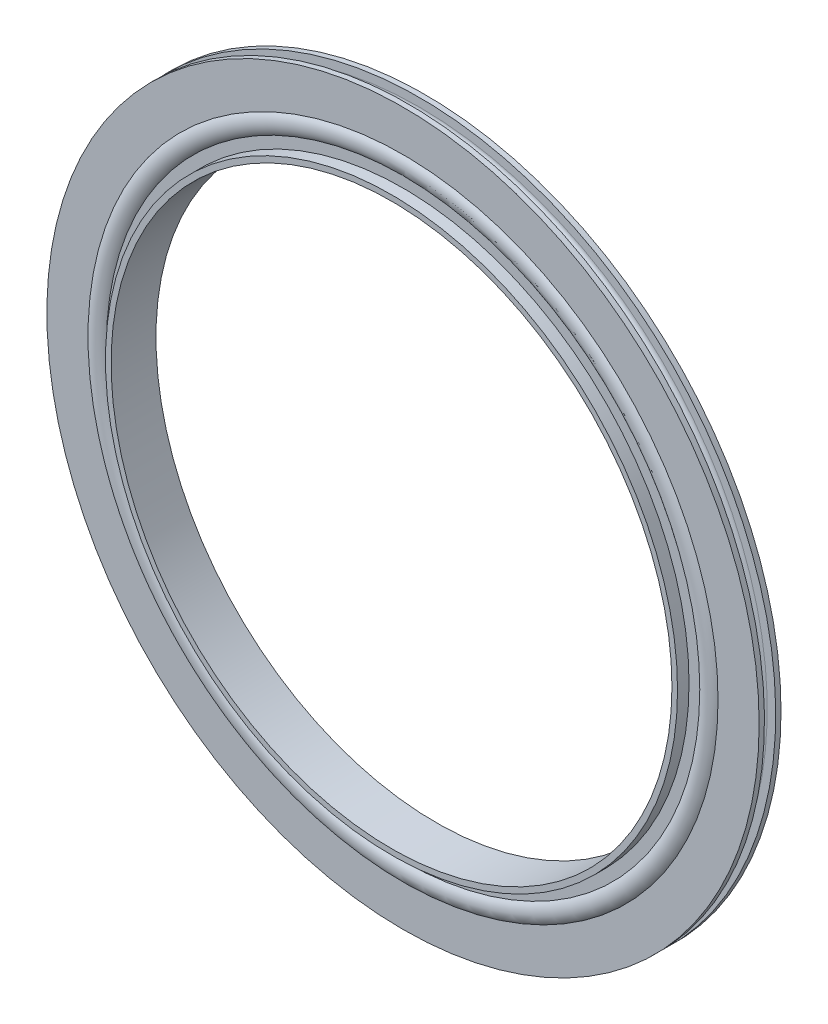
ISO-10303-21;
HEADER;
FILE_DESCRIPTION(('STEP AP214'),'2;1');
FILE_NAME('part.step','',(''),(''),'','','');
FILE_SCHEMA(('AUTOMOTIVE_DESIGN { 1 0 10303 214 1 1 1 1 }'));
ENDSEC;
DATA;
#1=APPLICATION_CONTEXT('core data for automotive mechanical design processes');
#2=APPLICATION_PROTOCOL_DEFINITION('international standard','automotive_design',2000,#1);
#3=PRODUCT_CONTEXT('',#1,'mechanical');
#4=PRODUCT('Part','Part','',(#3));
#5=PRODUCT_RELATED_PRODUCT_CATEGORY('part','',(#4));
#6=PRODUCT_DEFINITION_FORMATION('','',#4);
#7=PRODUCT_DEFINITION_CONTEXT('part definition',#1,'design');
#8=PRODUCT_DEFINITION('design','',#6,#7);
#9=PRODUCT_DEFINITION_SHAPE('','',#8);
#10=(LENGTH_UNIT() NAMED_UNIT(*) SI_UNIT(.MILLI.,.METRE.));
#11=(NAMED_UNIT(*) PLANE_ANGLE_UNIT() SI_UNIT($,.RADIAN.));
#12=(NAMED_UNIT(*) SI_UNIT($,.STERADIAN.) SOLID_ANGLE_UNIT());
#13=UNCERTAINTY_MEASURE_WITH_UNIT(LENGTH_MEASURE(1.E-05),#10,'distance_accuracy_value','');
#14=(GEOMETRIC_REPRESENTATION_CONTEXT(3) GLOBAL_UNCERTAINTY_ASSIGNED_CONTEXT((#13)) GLOBAL_UNIT_ASSIGNED_CONTEXT((#10,
#11,#12)) REPRESENTATION_CONTEXT('',''));
#15=CARTESIAN_POINT('',(0.,0.,0.));
#16=DIRECTION('',(0.,0.,1.));
#17=DIRECTION('',(1.,0.,0.));
#18=AXIS2_PLACEMENT_3D('',#15,#16,#17);
#19=CARTESIAN_POINT('',(0.,0.,1.95));
#20=DIRECTION('',(0.,0.,-1.));
#21=DIRECTION('',(-1.,0.,0.));
#22=AXIS2_PLACEMENT_3D('',#19,#20,#21);
#23=CYLINDRICAL_SURFACE('',#22,63.5);
#24=CARTESIAN_POINT('',(0.,0.,1.95));
#25=DIRECTION('',(0.,0.,1.));
#26=DIRECTION('',(1.,0.,0.));
#27=AXIS2_PLACEMENT_3D('',#24,#25,#26);
#28=CIRCLE('',#27,63.5);
#29=CARTESIAN_POINT('',(63.5,0.,1.95));
#30=VERTEX_POINT('',#29);
#31=EDGE_CURVE('E57',#30,#30,#28,.T.);
#32=ORIENTED_EDGE('',*,*,#31,.F.);
#33=EDGE_LOOP('',(#32));
#34=FACE_BOUND('',#33,.T.);
#35=CARTESIAN_POINT('',(0.,0.,1.));
#36=DIRECTION('',(0.,0.,1.));
#37=DIRECTION('',(0.,-1.,0.));
#38=AXIS2_PLACEMENT_3D('',#35,#36,#37);
#39=CIRCLE('',#38,63.5);
#40=CARTESIAN_POINT('',(0.,-63.5,0.999999999999992));
#41=VERTEX_POINT('',#40);
#42=EDGE_CURVE('E86',#41,#41,#39,.T.);
#43=ORIENTED_EDGE('',*,*,#42,.T.);
#44=EDGE_LOOP('',(#43));
#45=FACE_BOUND('',#44,.T.);
#46=ADVANCED_FACE('F43',(#34,#45),#23,.T.);
#47=CARTESIAN_POINT('',(0.,0.,-1.95));
#48=DIRECTION('',(0.,0.,1.));
#49=DIRECTION('',(1.,0.,0.));
#50=AXIS2_PLACEMENT_3D('',#47,#48,#49);
#51=CIRCLE('',#50,63.5);
#52=CARTESIAN_POINT('',(63.5,0.,-1.95));
#53=VERTEX_POINT('',#52);
#54=EDGE_CURVE('E60',#53,#53,#51,.T.);
#55=ORIENTED_EDGE('',*,*,#54,.T.);
#56=EDGE_LOOP('',(#55));
#57=FACE_BOUND('',#56,.T.);
#58=CARTESIAN_POINT('',(0.,0.,-1.));
#59=DIRECTION('',(0.,0.,1.));
#60=DIRECTION('',(0.,-1.,0.));
#61=AXIS2_PLACEMENT_3D('',#58,#59,#60);
#62=CIRCLE('',#61,63.5);
#63=CARTESIAN_POINT('',(0.,-63.5,-1.00000000000001));
#64=VERTEX_POINT('',#63);
#65=EDGE_CURVE('E95',#64,#64,#62,.T.);
#66=ORIENTED_EDGE('',*,*,#65,.F.);
#67=EDGE_LOOP('',(#66));
#68=FACE_BOUND('',#67,.T.);
#69=ADVANCED_FACE('F102',(#57,#68),#23,.T.);
#70=CARTESIAN_POINT('',(0.,0.,1.95));
#71=DIRECTION('',(0.,0.,1.));
#72=DIRECTION('',(1.,0.,0.));
#73=AXIS2_PLACEMENT_3D('',#70,#71,#72);
#74=PLANE('',#73);
#75=CARTESIAN_POINT('',(0.,0.,1.95));
#76=DIRECTION('',(0.,0.,1.));
#77=DIRECTION('',(1.,0.,0.));
#78=AXIS2_PLACEMENT_3D('',#75,#76,#77);
#79=CIRCLE('',#78,51.);
#80=CARTESIAN_POINT('',(51.,0.,1.95));
#81=VERTEX_POINT('',#80);
#82=EDGE_CURVE('E63',#81,#81,#79,.F.);
#83=ORIENTED_EDGE('',*,*,#82,.T.);
#84=EDGE_LOOP('',(#83));
#85=FACE_BOUND('',#84,.T.);
#86=CARTESIAN_POINT('',(0.,0.,1.95));
#87=DIRECTION('',(0.,0.,-1.));
#88=DIRECTION('',(-1.,0.,0.));
#89=AXIS2_PLACEMENT_3D('',#86,#87,#88);
#90=CIRCLE('',#89,52.9123943966673);
#91=CARTESIAN_POINT('',(-52.9123943966673,0.,1.95));
#92=VERTEX_POINT('',#91);
#93=EDGE_CURVE('E83',#92,#92,#90,.F.);
#94=ORIENTED_EDGE('',*,*,#93,.T.);
#95=EDGE_LOOP('',(#94));
#96=FACE_BOUND('',#95,.T.);
#97=ADVANCED_FACE('F104',(#85,#96),#74,.T.);
#98=CARTESIAN_POINT('',(0.,0.,-1.95));
#99=DIRECTION('',(0.,0.,1.));
#100=DIRECTION('',(1.,0.,0.));
#101=AXIS2_PLACEMENT_3D('',#98,#99,#100);
#102=PLANE('',#101);
#103=CARTESIAN_POINT('',(0.,0.,-1.95));
#104=DIRECTION('',(0.,0.,1.));
#105=DIRECTION('',(1.,0.,0.));
#106=AXIS2_PLACEMENT_3D('',#103,#104,#105);
#107=CIRCLE('',#106,51.);
#108=CARTESIAN_POINT('',(51.,0.,-1.95));
#109=VERTEX_POINT('',#108);
#110=EDGE_CURVE('E53',#109,#109,#107,.F.);
#111=ORIENTED_EDGE('',*,*,#110,.F.);
#112=EDGE_LOOP('',(#111));
#113=FACE_BOUND('',#112,.T.);
#114=CARTESIAN_POINT('',(0.,0.,-1.95));
#115=DIRECTION('',(0.,0.,-1.));
#116=DIRECTION('',(-1.,0.,0.));
#117=AXIS2_PLACEMENT_3D('',#114,#115,#116);
#118=CIRCLE('',#117,52.9123943966673);
#119=CARTESIAN_POINT('',(-52.9123943966673,0.,-1.95));
#120=VERTEX_POINT('',#119);
#121=EDGE_CURVE('E49',#120,#120,#118,.F.);
#122=ORIENTED_EDGE('',*,*,#121,.F.);
#123=EDGE_LOOP('',(#122));
#124=FACE_BOUND('',#123,.T.);
#125=ADVANCED_FACE('F111',(#113,#124),#102,.F.);
#126=CARTESIAN_POINT('',(0.,0.,-4.));
#127=DIRECTION('',(0.,0.,1.));
#128=DIRECTION('',(1.,0.,0.));
#129=AXIS2_PLACEMENT_3D('',#126,#127,#128);
#130=PLANE('',#129);
#131=CARTESIAN_POINT('',(0.,0.,-4.));
#132=DIRECTION('',(0.,0.,1.));
#133=DIRECTION('',(1.,0.,0.));
#134=AXIS2_PLACEMENT_3D('',#131,#132,#133);
#135=CIRCLE('',#134,50.);
#136=CARTESIAN_POINT('',(50.,0.,-4.));
#137=VERTEX_POINT('',#136);
#138=EDGE_CURVE('E72',#137,#137,#135,.T.);
#139=ORIENTED_EDGE('',*,*,#138,.T.);
#140=EDGE_LOOP('',(#139));
#141=FACE_BOUND('',#140,.T.);
#142=CARTESIAN_POINT('',(0.,0.,-4.));
#143=DIRECTION('',(0.,0.,1.));
#144=DIRECTION('',(1.,0.,0.));
#145=AXIS2_PLACEMENT_3D('',#142,#143,#144);
#146=CIRCLE('',#145,51.);
#147=CARTESIAN_POINT('',(51.,0.,-4.));
#148=VERTEX_POINT('',#147);
#149=EDGE_CURVE('E69',#148,#148,#146,.T.);
#150=ORIENTED_EDGE('',*,*,#149,.F.);
#151=EDGE_LOOP('',(#150));
#152=FACE_BOUND('',#151,.T.);
#153=ADVANCED_FACE('F133',(#141,#152),#130,.F.);
#154=CARTESIAN_POINT('',(0.,0.,4.));
#155=DIRECTION('',(0.,0.,-1.));
#156=DIRECTION('',(-1.,0.,0.));
#157=AXIS2_PLACEMENT_3D('',#154,#155,#156);
#158=CYLINDRICAL_SURFACE('',#157,51.);
#159=ORIENTED_EDGE('',*,*,#149,.T.);
#160=EDGE_LOOP('',(#159));
#161=FACE_BOUND('',#160,.T.);
#162=ORIENTED_EDGE('',*,*,#110,.T.);
#163=EDGE_LOOP('',(#162));
#164=FACE_BOUND('',#163,.T.);
#165=ADVANCED_FACE('F139',(#161,#164),#158,.T.);
#166=ORIENTED_EDGE('',*,*,#82,.F.);
#167=EDGE_LOOP('',(#166));
#168=FACE_BOUND('',#167,.T.);
#169=CARTESIAN_POINT('',(0.,0.,4.));
#170=DIRECTION('',(0.,0.,1.));
#171=DIRECTION('',(1.,0.,0.));
#172=AXIS2_PLACEMENT_3D('',#169,#170,#171);
#173=CIRCLE('',#172,51.);
#174=CARTESIAN_POINT('',(51.,0.,4.));
#175=VERTEX_POINT('',#174);
#176=EDGE_CURVE('E68',#175,#175,#173,.T.);
#177=ORIENTED_EDGE('',*,*,#176,.F.);
#178=EDGE_LOOP('',(#177));
#179=FACE_BOUND('',#178,.T.);
#180=ADVANCED_FACE('F146',(#168,#179),#158,.T.);
#181=CARTESIAN_POINT('',(0.,0.,4.));
#182=DIRECTION('',(0.,0.,1.));
#183=DIRECTION('',(1.,0.,0.));
#184=AXIS2_PLACEMENT_3D('',#181,#182,#183);
#185=PLANE('',#184);
#186=CARTESIAN_POINT('',(0.,0.,4.));
#187=DIRECTION('',(0.,0.,1.));
#188=DIRECTION('',(1.,0.,0.));
#189=AXIS2_PLACEMENT_3D('',#186,#187,#188);
#190=CIRCLE('',#189,50.);
#191=CARTESIAN_POINT('',(50.,0.,4.));
#192=VERTEX_POINT('',#191);
#193=EDGE_CURVE('E75',#192,#192,#190,.T.);
#194=ORIENTED_EDGE('',*,*,#193,.F.);
#195=EDGE_LOOP('',(#194));
#196=FACE_BOUND('',#195,.T.);
#197=ORIENTED_EDGE('',*,*,#176,.T.);
#198=EDGE_LOOP('',(#197));
#199=FACE_BOUND('',#198,.T.);
#200=ADVANCED_FACE('F152',(#196,#199),#185,.T.);
#201=CARTESIAN_POINT('',(0.,0.,-4.));
#202=DIRECTION('',(0.,0.,1.));
#203=DIRECTION('',(1.,0.,0.));
#204=AXIS2_PLACEMENT_3D('',#201,#202,#203);
#205=CYLINDRICAL_SURFACE('',#204,50.);
#206=ORIENTED_EDGE('',*,*,#138,.F.);
#207=EDGE_LOOP('',(#206));
#208=FACE_BOUND('',#207,.T.);
#209=ORIENTED_EDGE('',*,*,#193,.T.);
#210=EDGE_LOOP('',(#209));
#211=FACE_BOUND('',#210,.T.);
#212=ADVANCED_FACE('F157',(#208,#211),#205,.F.);
#213=CARTESIAN_POINT('',(0.,0.,0.));
#214=DIRECTION('',(0.,0.,1.));
#215=DIRECTION('',(1.,0.,0.));
#216=AXIS2_PLACEMENT_3D('',#213,#214,#215);
#217=TOROIDAL_SURFACE('',#216,54.54,2.54);
#218=ORIENTED_EDGE('',*,*,#121,.T.);
#219=EDGE_LOOP('',(#218));
#220=FACE_BOUND('',#219,.T.);
#221=CARTESIAN_POINT('',(0.,0.,-1.95));
#222=DIRECTION('',(0.,0.,1.));
#223=DIRECTION('',(1.,0.,0.));
#224=AXIS2_PLACEMENT_3D('',#221,#222,#223);
#225=CIRCLE('',#224,56.1676056033327);
#226=CARTESIAN_POINT('',(56.1676056033327,0.,-1.95));
#227=VERTEX_POINT('',#226);
#228=EDGE_CURVE('E10',#227,#227,#225,.F.);
#229=ORIENTED_EDGE('',*,*,#228,.T.);
#230=EDGE_LOOP('',(#229));
#231=FACE_BOUND('',#230,.T.);
#232=ADVANCED_FACE('F130',(#220,#231),#217,.T.);
#233=ORIENTED_EDGE('',*,*,#31,.T.);
#234=EDGE_LOOP('',(#233));
#235=FACE_BOUND('',#234,.T.);
#236=CARTESIAN_POINT('',(0.,0.,1.95));
#237=DIRECTION('',(0.,0.,1.));
#238=DIRECTION('',(1.,0.,0.));
#239=AXIS2_PLACEMENT_3D('',#236,#237,#238);
#240=CIRCLE('',#239,56.1676056033327);
#241=CARTESIAN_POINT('',(56.1676056033327,0.,1.95));
#242=VERTEX_POINT('',#241);
#243=EDGE_CURVE('E78',#242,#242,#240,.F.);
#244=ORIENTED_EDGE('',*,*,#243,.T.);
#245=EDGE_LOOP('',(#244));
#246=FACE_BOUND('',#245,.T.);
#247=ADVANCED_FACE('F114',(#235,#246),#74,.T.);
#248=ORIENTED_EDGE('',*,*,#54,.F.);
#249=EDGE_LOOP('',(#248));
#250=FACE_BOUND('',#249,.T.);
#251=ORIENTED_EDGE('',*,*,#228,.F.);
#252=EDGE_LOOP('',(#251));
#253=FACE_BOUND('',#252,.T.);
#254=ADVANCED_FACE('F118',(#250,#253),#102,.F.);
#255=ORIENTED_EDGE('',*,*,#243,.F.);
#256=EDGE_LOOP('',(#255));
#257=FACE_BOUND('',#256,.T.);
#258=ORIENTED_EDGE('',*,*,#93,.F.);
#259=EDGE_LOOP('',(#258));
#260=FACE_BOUND('',#259,.T.);
#261=ADVANCED_FACE('F121',(#257,#260),#217,.T.);
#262=CARTESIAN_POINT('',(0.,63.5,1.00000000000001));
#263=DIRECTION('',(0.,0.,-1.));
#264=DIRECTION('',(0.,1.,0.));
#265=AXIS2_PLACEMENT_3D('',#262,#263,#264);
#266=PLANE('',#265);
#267=CARTESIAN_POINT('',(0.,0.,1.));
#268=DIRECTION('',(0.,0.,1.));
#269=DIRECTION('',(0.,-1.,0.));
#270=AXIS2_PLACEMENT_3D('',#267,#268,#269);
#271=CIRCLE('',#270,62.);
#272=CARTESIAN_POINT('',(0.,-62.,0.999999999999992));
#273=VERTEX_POINT('',#272);
#274=EDGE_CURVE('E89',#273,#273,#271,.T.);
#275=ORIENTED_EDGE('',*,*,#274,.T.);
#276=EDGE_LOOP('',(#275));
#277=FACE_BOUND('',#276,.T.);
#278=ORIENTED_EDGE('',*,*,#42,.F.);
#279=EDGE_LOOP('',(#278));
#280=FACE_BOUND('',#279,.T.);
#281=ADVANCED_FACE('F127',(#277,#280),#266,.T.);
#282=CARTESIAN_POINT('',(0.,0.,0.));
#283=DIRECTION('',(0.,0.,1.));
#284=DIRECTION('',(0.,-1.,0.));
#285=AXIS2_PLACEMENT_3D('',#282,#283,#284);
#286=TOROIDAL_SURFACE('',#285,62.,1.);
#287=CARTESIAN_POINT('',(0.,0.,-1.00000000000001));
#288=DIRECTION('',(0.,0.,1.));
#289=DIRECTION('',(0.,-1.,0.));
#290=AXIS2_PLACEMENT_3D('',#287,#288,#289);
#291=CIRCLE('',#290,62.);
#292=CARTESIAN_POINT('',(0.,-62.,-1.00000000000002));
#293=VERTEX_POINT('',#292);
#294=EDGE_CURVE('E92',#293,#293,#291,.T.);
#295=ORIENTED_EDGE('',*,*,#294,.T.);
#296=EDGE_LOOP('',(#295));
#297=FACE_BOUND('',#296,.T.);
#298=ORIENTED_EDGE('',*,*,#274,.F.);
#299=EDGE_LOOP('',(#298));
#300=FACE_BOUND('',#299,.T.);
#301=ADVANCED_FACE('F163',(#297,#300),#286,.F.);
#302=CARTESIAN_POINT('',(0.,62.,-0.999999999999996));
#303=DIRECTION('',(0.,0.,1.));
#304=DIRECTION('',(0.,-1.,0.));
#305=AXIS2_PLACEMENT_3D('',#302,#303,#304);
#306=PLANE('',#305);
#307=ORIENTED_EDGE('',*,*,#65,.T.);
#308=EDGE_LOOP('',(#307));
#309=FACE_BOUND('',#308,.T.);
#310=ORIENTED_EDGE('',*,*,#294,.F.);
#311=EDGE_LOOP('',(#310));
#312=FACE_BOUND('',#311,.T.);
#313=ADVANCED_FACE('F99',(#309,#312),#306,.T.);
#314=CLOSED_SHELL('',(#46,#69,#97,#125,#153,#165,#180,#200,#212,#232,#247,#254,#261,#281,#301,#313));
#315=MANIFOLD_SOLID_BREP('B2',#314);
#316=ADVANCED_BREP_SHAPE_REPRESENTATION('',(#18,#315),#14);
#317=SHAPE_DEFINITION_REPRESENTATION(#9,#316);
ENDSEC;
END-ISO-10303-21;
